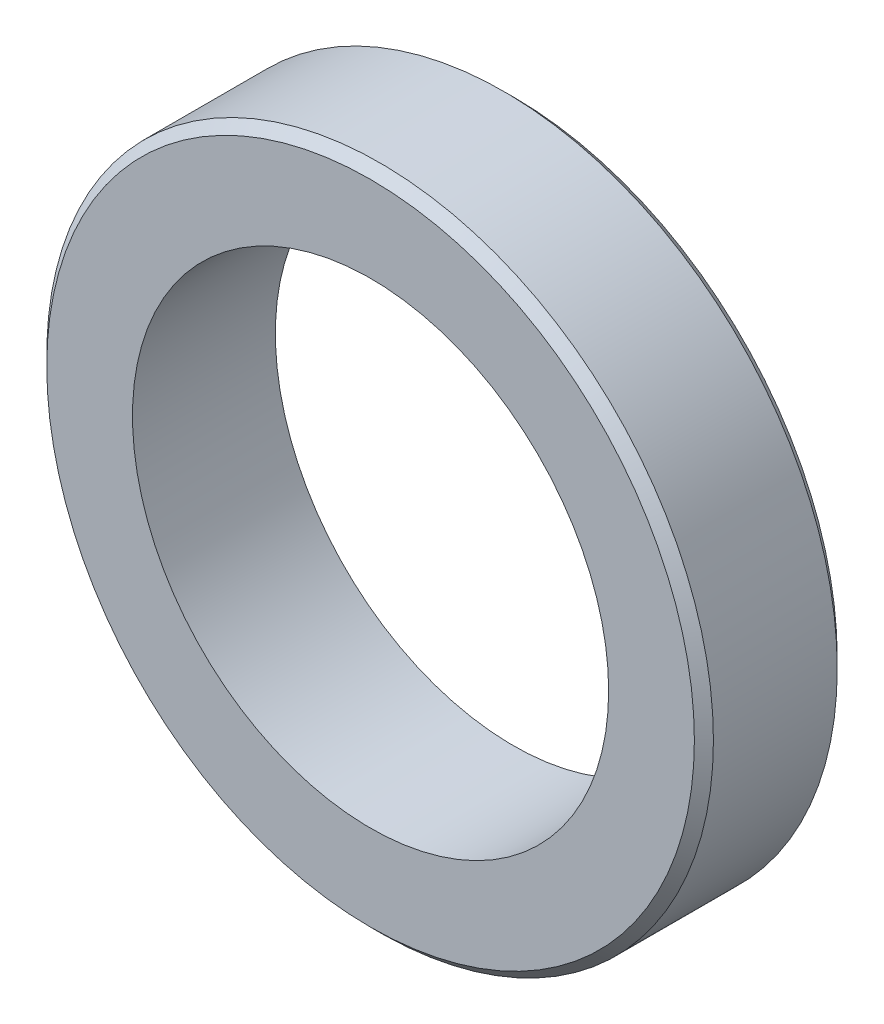
ISO-10303-21;
HEADER;
FILE_DESCRIPTION(('STEP AP214'),'2;1');
FILE_NAME('part.step','',(''),(''),'','','');
FILE_SCHEMA(('AUTOMOTIVE_DESIGN { 1 0 10303 214 1 1 1 1 }'));
ENDSEC;
DATA;
#1=APPLICATION_CONTEXT('core data for automotive mechanical design processes');
#2=APPLICATION_PROTOCOL_DEFINITION('international standard','automotive_design',2000,#1);
#3=PRODUCT_CONTEXT('',#1,'mechanical');
#4=PRODUCT('Part','Part','',(#3));
#5=PRODUCT_RELATED_PRODUCT_CATEGORY('part','',(#4));
#6=PRODUCT_DEFINITION_FORMATION('','',#4);
#7=PRODUCT_DEFINITION_CONTEXT('part definition',#1,'design');
#8=PRODUCT_DEFINITION('design','',#6,#7);
#9=PRODUCT_DEFINITION_SHAPE('','',#8);
#10=(LENGTH_UNIT() NAMED_UNIT(*) SI_UNIT(.MILLI.,.METRE.));
#11=(NAMED_UNIT(*) PLANE_ANGLE_UNIT() SI_UNIT($,.RADIAN.));
#12=(NAMED_UNIT(*) SI_UNIT($,.STERADIAN.) SOLID_ANGLE_UNIT());
#13=UNCERTAINTY_MEASURE_WITH_UNIT(LENGTH_MEASURE(1.E-05),#10,'distance_accuracy_value','');
#14=(GEOMETRIC_REPRESENTATION_CONTEXT(3) GLOBAL_UNCERTAINTY_ASSIGNED_CONTEXT((#13)) GLOBAL_UNIT_ASSIGNED_CONTEXT((#10,
#11,#12)) REPRESENTATION_CONTEXT('',''));
#15=CARTESIAN_POINT('',(0.,0.,0.));
#16=DIRECTION('',(0.,0.,1.));
#17=DIRECTION('',(1.,0.,0.));
#18=AXIS2_PLACEMENT_3D('',#15,#16,#17);
#19=CARTESIAN_POINT('',(0.,0.,15.));
#20=DIRECTION('',(0.,0.,1.));
#21=DIRECTION('',(1.,0.,0.));
#22=AXIS2_PLACEMENT_3D('',#19,#20,#21);
#23=PLANE('',#22);
#24=CARTESIAN_POINT('',(0.,0.,15.));
#25=DIRECTION('',(0.,0.,1.));
#26=DIRECTION('',(1.,0.,0.));
#27=AXIS2_PLACEMENT_3D('',#24,#25,#26);
#28=CIRCLE('',#27,34.);
#29=CARTESIAN_POINT('',(34.,0.,15.));
#30=VERTEX_POINT('',#29);
#31=EDGE_CURVE('E55',#30,#30,#28,.T.);
#32=ORIENTED_EDGE('',*,*,#31,.T.);
#33=EDGE_LOOP('',(#32));
#34=FACE_BOUND('',#33,.T.);
#35=CARTESIAN_POINT('',(0.,0.,15.));
#36=DIRECTION('',(0.,0.,1.));
#37=DIRECTION('',(1.,0.,0.));
#38=AXIS2_PLACEMENT_3D('',#35,#36,#37);
#39=CIRCLE('',#38,25.);
#40=CARTESIAN_POINT('',(25.,0.,15.));
#41=VERTEX_POINT('',#40);
#42=EDGE_CURVE('E60',#41,#41,#39,.T.);
#43=ORIENTED_EDGE('',*,*,#42,.F.);
#44=EDGE_LOOP('',(#43));
#45=FACE_BOUND('',#44,.T.);
#46=ADVANCED_FACE('F39',(#34,#45),#23,.T.);
#47=CARTESIAN_POINT('',(0.,0.,0.));
#48=DIRECTION('',(0.,0.,1.));
#49=DIRECTION('',(1.,0.,0.));
#50=AXIS2_PLACEMENT_3D('',#47,#48,#49);
#51=PLANE('',#50);
#52=CARTESIAN_POINT('',(0.,0.,0.));
#53=DIRECTION('',(0.,0.,1.));
#54=DIRECTION('',(1.,0.,0.));
#55=AXIS2_PLACEMENT_3D('',#52,#53,#54);
#56=CIRCLE('',#55,34.);
#57=CARTESIAN_POINT('',(34.,0.,0.));
#58=VERTEX_POINT('',#57);
#59=EDGE_CURVE('E10',#58,#58,#56,.F.);
#60=ORIENTED_EDGE('',*,*,#59,.T.);
#61=EDGE_LOOP('',(#60));
#62=FACE_BOUND('',#61,.T.);
#63=CARTESIAN_POINT('',(0.,0.,0.));
#64=DIRECTION('',(0.,0.,1.));
#65=DIRECTION('',(1.,0.,0.));
#66=AXIS2_PLACEMENT_3D('',#63,#64,#65);
#67=CIRCLE('',#66,25.);
#68=CARTESIAN_POINT('',(25.,0.,0.));
#69=VERTEX_POINT('',#68);
#70=EDGE_CURVE('E61',#69,#69,#67,.T.);
#71=ORIENTED_EDGE('',*,*,#70,.T.);
#72=EDGE_LOOP('',(#71));
#73=FACE_BOUND('',#72,.T.);
#74=ADVANCED_FACE('F71',(#62,#73),#51,.F.);
#75=CARTESIAN_POINT('',(0.,0.,15.));
#76=DIRECTION('',(0.,0.,-1.));
#77=DIRECTION('',(-1.,0.,0.));
#78=AXIS2_PLACEMENT_3D('',#75,#76,#77);
#79=CYLINDRICAL_SURFACE('',#78,35.);
#80=CARTESIAN_POINT('',(0.,0.,14.));
#81=DIRECTION('',(0.,0.,1.));
#82=DIRECTION('',(1.,0.,0.));
#83=AXIS2_PLACEMENT_3D('',#80,#81,#82);
#84=CIRCLE('',#83,35.);
#85=CARTESIAN_POINT('',(35.,0.,14.));
#86=VERTEX_POINT('',#85);
#87=EDGE_CURVE('E47',#86,#86,#84,.F.);
#88=ORIENTED_EDGE('',*,*,#87,.T.);
#89=EDGE_LOOP('',(#88));
#90=FACE_BOUND('',#89,.T.);
#91=CARTESIAN_POINT('',(0.,0.,1.));
#92=DIRECTION('',(0.,0.,1.));
#93=DIRECTION('',(1.,0.,0.));
#94=AXIS2_PLACEMENT_3D('',#91,#92,#93);
#95=CIRCLE('',#94,35.);
#96=CARTESIAN_POINT('',(35.,0.,1.));
#97=VERTEX_POINT('',#96);
#98=EDGE_CURVE('E51',#97,#97,#95,.T.);
#99=ORIENTED_EDGE('',*,*,#98,.T.);
#100=EDGE_LOOP('',(#99));
#101=FACE_BOUND('',#100,.T.);
#102=ADVANCED_FACE('F78',(#90,#101),#79,.T.);
#103=CARTESIAN_POINT('',(0.,0.,15.));
#104=DIRECTION('',(0.,0.,-1.));
#105=DIRECTION('',(-1.,0.,0.));
#106=AXIS2_PLACEMENT_3D('',#103,#104,#105);
#107=CYLINDRICAL_SURFACE('',#106,25.);
#108=ORIENTED_EDGE('',*,*,#42,.T.);
#109=EDGE_LOOP('',(#108));
#110=FACE_BOUND('',#109,.T.);
#111=ORIENTED_EDGE('',*,*,#70,.F.);
#112=EDGE_LOOP('',(#111));
#113=FACE_BOUND('',#112,.T.);
#114=ADVANCED_FACE('F67',(#110,#113),#107,.F.);
#115=CARTESIAN_POINT('',(0.,0.,15.));
#116=DIRECTION('',(0.,0.,-1.));
#117=DIRECTION('',(-1.,0.,0.));
#118=AXIS2_PLACEMENT_3D('',#115,#116,#117);
#119=CONICAL_SURFACE('',#118,34.,0.785398163397448);
#120=ORIENTED_EDGE('',*,*,#87,.F.);
#121=EDGE_LOOP('',(#120));
#122=FACE_BOUND('',#121,.T.);
#123=ORIENTED_EDGE('',*,*,#31,.F.);
#124=EDGE_LOOP('',(#123));
#125=FACE_BOUND('',#124,.T.);
#126=ADVANCED_FACE('F84',(#122,#125),#119,.T.);
#127=CARTESIAN_POINT('',(0.,0.,1.));
#128=DIRECTION('',(0.,0.,1.));
#129=DIRECTION('',(1.,0.,0.));
#130=AXIS2_PLACEMENT_3D('',#127,#128,#129);
#131=CONICAL_SURFACE('',#130,35.,0.785398163397445);
#132=ORIENTED_EDGE('',*,*,#59,.F.);
#133=EDGE_LOOP('',(#132));
#134=FACE_BOUND('',#133,.T.);
#135=ORIENTED_EDGE('',*,*,#98,.F.);
#136=EDGE_LOOP('',(#135));
#137=FACE_BOUND('',#136,.T.);
#138=ADVANCED_FACE('F42',(#134,#137),#131,.T.);
#139=CLOSED_SHELL('',(#46,#74,#102,#114,#126,#138));
#140=MANIFOLD_SOLID_BREP('B2',#139);
#141=ADVANCED_BREP_SHAPE_REPRESENTATION('',(#18,#140),#14);
#142=SHAPE_DEFINITION_REPRESENTATION(#9,#141);
ENDSEC;
END-ISO-10303-21;
